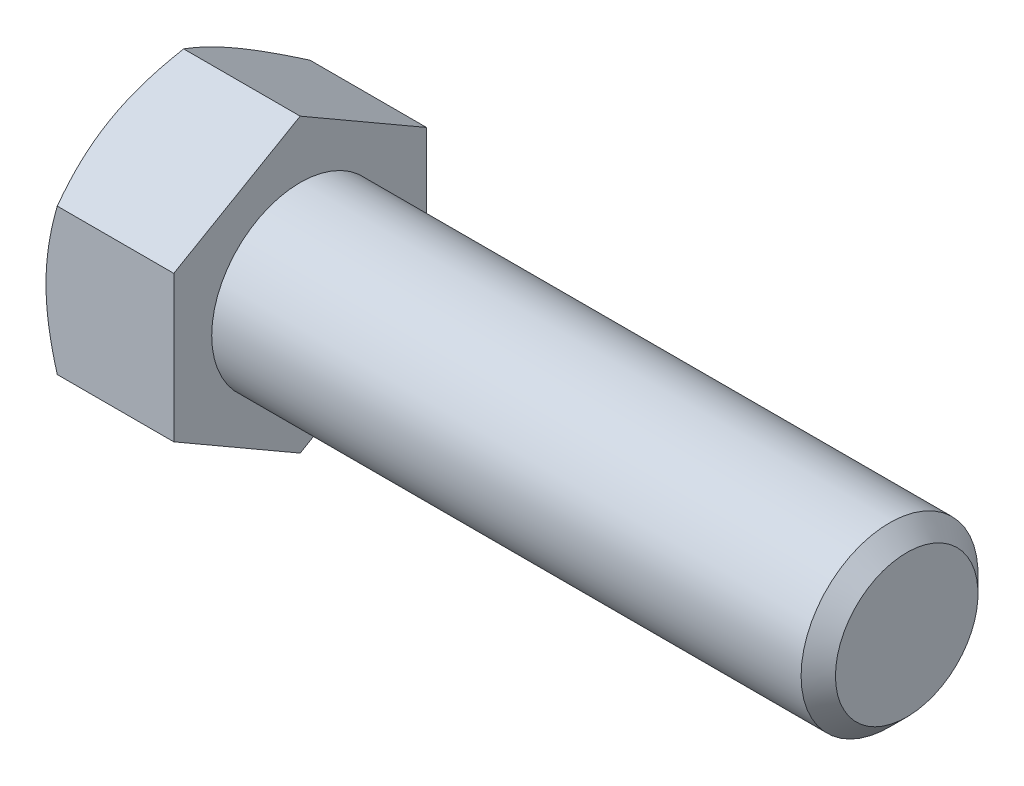
ISO-10303-21;
HEADER;
FILE_DESCRIPTION(('STEP AP214'),'2;1');
FILE_NAME('part.step','',(''),(''),'','','');
FILE_SCHEMA(('AUTOMOTIVE_DESIGN { 1 0 10303 214 1 1 1 1 }'));
ENDSEC;
DATA;
#1=APPLICATION_CONTEXT('core data for automotive mechanical design processes');
#2=APPLICATION_PROTOCOL_DEFINITION('international standard','automotive_design',2000,#1);
#3=PRODUCT_CONTEXT('',#1,'mechanical');
#4=PRODUCT('Part','Part','',(#3));
#5=PRODUCT_RELATED_PRODUCT_CATEGORY('part','',(#4));
#6=PRODUCT_DEFINITION_FORMATION('','',#4);
#7=PRODUCT_DEFINITION_CONTEXT('part definition',#1,'design');
#8=PRODUCT_DEFINITION('design','',#6,#7);
#9=PRODUCT_DEFINITION_SHAPE('','',#8);
#10=(LENGTH_UNIT() NAMED_UNIT(*) SI_UNIT(.MILLI.,.METRE.));
#11=(NAMED_UNIT(*) PLANE_ANGLE_UNIT() SI_UNIT($,.RADIAN.));
#12=(NAMED_UNIT(*) SI_UNIT($,.STERADIAN.) SOLID_ANGLE_UNIT());
#13=UNCERTAINTY_MEASURE_WITH_UNIT(LENGTH_MEASURE(1.E-05),#10,'distance_accuracy_value','');
#14=(GEOMETRIC_REPRESENTATION_CONTEXT(3) GLOBAL_UNCERTAINTY_ASSIGNED_CONTEXT((#13)) GLOBAL_UNIT_ASSIGNED_CONTEXT((#10,
#11,#12)) REPRESENTATION_CONTEXT('',''));
#15=CARTESIAN_POINT('',(0.,0.,0.));
#16=DIRECTION('',(0.,0.,1.));
#17=DIRECTION('',(1.,0.,0.));
#18=AXIS2_PLACEMENT_3D('',#15,#16,#17);
#19=CARTESIAN_POINT('',(8.0264,4.58271776169265,-7.9375));
#20=DIRECTION('',(0.,-0.866025403784438,0.500000000000001));
#21=DIRECTION('',(0.,-0.500000000000001,-0.866025403784438));
#22=AXIS2_PLACEMENT_3D('',#19,#20,#21);
#23=PLANE('',#22);
#24=CARTESIAN_POINT('',(0.709015572900506,9.16555099343915,0.0002));
#25=CARTESIAN_POINT('',(0.650866285897757,9.06481781768609,-0.174274978412064));
#26=CARTESIAN_POINT('',(0.595356039210451,8.96370907296841,-0.349400461352612));
#27=CARTESIAN_POINT('',(0.490340491808393,8.76067044758428,-0.701073676416866));
#28=CARTESIAN_POINT('',(0.440837783112744,8.65874023256945,-0.877621987648966));
#29=CARTESIAN_POINT('',(0.302312723142106,8.35131756198171,-1.41009367250543));
#30=CARTESIAN_POINT('',(0.223521451359134,8.14461157174231,-1.76811894982892));
#31=CARTESIAN_POINT('',(0.131129350120146,7.83528005201998,-2.30389685837049));
#32=CARTESIAN_POINT('',(0.10480950372743,7.7335786419499,-2.48004886781326));
#33=CARTESIAN_POINT('',(0.0606755611211444,7.529715897244,-2.83314949941432));
#34=CARTESIAN_POINT('',(0.0428607133854623,7.42755460405011,-3.01009804979308));
#35=CARTESIAN_POINT('',(0.0161882579707897,7.22305611120213,-3.36429982947704));
#36=CARTESIAN_POINT('',(0.00732048505625425,7.12071924380247,-3.54155248330069));
#37=CARTESIAN_POINT('',(-0.00126770549347207,6.91595097051382,-3.89622153641478));
#38=CARTESIAN_POINT('',(-0.000988405729574594,6.81351956764329,-4.07363793047708));
#39=CARTESIAN_POINT('',(0.00808134398118646,6.62202014420249,-4.4053246614967));
#40=CARTESIAN_POINT('',(0.0157654088390005,6.5329386103014,-4.55961840422956));
#41=CARTESIAN_POINT('',(0.0379026215782355,6.35498418068026,-4.86784451776532));
#42=CARTESIAN_POINT('',(0.0523562257657427,6.26611129943051,-5.02177686350492));
#43=CARTESIAN_POINT('',(0.105529699236182,5.99983671771855,-5.48297796779418));
#44=CARTESIAN_POINT('',(0.154055589218093,5.82290634641812,-5.78943036028855));
#45=CARTESIAN_POINT('',(0.275371211073294,5.46716874857669,-6.4055859539124));
#46=CARTESIAN_POINT('',(0.348675201689143,5.2884069236772,-6.71521051709206));
#47=CARTESIAN_POINT('',(0.515044991415641,4.93354909534665,-7.32984230522412));
#48=CARTESIAN_POINT('',(0.60807171394553,4.75744854757844,-7.63485740119938));
#49=CARTESIAN_POINT('',(0.709015572900499,4.58260229163881,-7.9377));
#50=B_SPLINE_CURVE_WITH_KNOTS('',3,(#24,#25,#26,#27,#28,#29,#30,#31,#32,#33,#34,#35,#36,#37,#38,
#39,#40,#41,#42,#43,#44,#45,#46,#47,#48,#49),.UNSPECIFIED.,.F.,.F.,(4,2,2,2,2,2,2,2,2,2,2,2,4),
(0.,0.629020687135154,1.25831181455685,2.51950872534226,3.1346613754238,3.74975965907412,
4.36415830804191,4.97853797504021,5.51339074736726,6.04827957705289,7.11881916910899,
8.21310135188791,9.30523536686631),.UNSPECIFIED.);
#51=CARTESIAN_POINT('',(0.708948904974013,9.16543552338532,0.));
#52=VERTEX_POINT('',#51);
#53=CARTESIAN_POINT('',(0.,6.87407664253898,-3.96875000000001));
#54=VERTEX_POINT('',#53);
#55=EDGE_CURVE('E53',#52,#54,#50,.T.);
#56=ORIENTED_EDGE('',*,*,#55,.F.);
#57=DIRECTION('',(-1.,0.,0.));
#58=VECTOR('',#57,1.);
#59=CARTESIAN_POINT('',(8.0264,9.16543552338532,0.));
#60=LINE('',#59,#58);
#61=CARTESIAN_POINT('',(8.0264,9.16543552338532,0.));
#62=VERTEX_POINT('',#61);
#63=EDGE_CURVE('E149',#62,#52,#60,.T.);
#64=ORIENTED_EDGE('',*,*,#63,.F.);
#65=DIRECTION('',(0.,0.500000000000001,0.866025403784438));
#66=VECTOR('',#65,1.);
#67=CARTESIAN_POINT('',(8.0264,4.58271776169265,-7.9375));
#68=LINE('',#67,#66);
#69=CARTESIAN_POINT('',(8.0264,4.58271776169265,-7.9375));
#70=VERTEX_POINT('',#69);
#71=EDGE_CURVE('E240',#70,#62,#68,.T.);
#72=ORIENTED_EDGE('',*,*,#71,.F.);
#73=DIRECTION('',(-1.,0.,0.));
#74=VECTOR('',#73,1.);
#75=CARTESIAN_POINT('',(8.0264,4.58271776169265,-7.9375));
#76=LINE('',#75,#74);
#77=CARTESIAN_POINT('',(0.708948904974006,4.58271776169265,-7.9375));
#78=VERTEX_POINT('',#77);
#79=EDGE_CURVE('E137',#70,#78,#76,.T.);
#80=ORIENTED_EDGE('',*,*,#79,.T.);
#81=EDGE_CURVE('E131',#54,#78,#50,.T.);
#82=ORIENTED_EDGE('',*,*,#81,.F.);
#83=EDGE_LOOP('',(#56,#64,#72,#80,#82));
#84=FACE_BOUND('',#83,.T.);
#85=ADVANCED_FACE('F37',(#84),#23,.F.);
#86=CARTESIAN_POINT('',(8.0264,9.16543552338532,0.));
#87=DIRECTION('',(0.,-0.866025403784438,-0.500000000000001));
#88=DIRECTION('',(0.,0.500000000000001,-0.866025403784438));
#89=AXIS2_PLACEMENT_3D('',#86,#87,#88);
#90=PLANE('',#89);
#91=CARTESIAN_POINT('',(0.709015572900498,4.58260229163881,7.9377));
#92=CARTESIAN_POINT('',(0.650866285897749,4.68333546739187,7.76322502158793));
#93=CARTESIAN_POINT('',(0.595356039210444,4.78444421210956,7.58809953864739));
#94=CARTESIAN_POINT('',(0.490340491808387,4.98748283749369,7.23642632358313));
#95=CARTESIAN_POINT('',(0.440837783112737,5.08941305250851,7.05987801235103));
#96=CARTESIAN_POINT('',(0.302312723142101,5.39683572309625,6.52740632749457));
#97=CARTESIAN_POINT('',(0.223521451359131,5.60354171333565,6.16938105017108));
#98=CARTESIAN_POINT('',(0.131129350120143,5.91287323305798,5.63360314162951));
#99=CARTESIAN_POINT('',(0.104809503727426,6.01457464312806,5.45745113218674));
#100=CARTESIAN_POINT('',(0.0606755611211416,6.21843738783396,5.10435050058568));
#101=CARTESIAN_POINT('',(0.0428607133854604,6.32059868102785,4.92740195020693));
#102=CARTESIAN_POINT('',(0.016188257970789,6.52509717387583,4.57320017052296));
#103=CARTESIAN_POINT('',(0.00732048505625397,6.62743404127549,4.39594751669932));
#104=CARTESIAN_POINT('',(-0.0012677054934723,6.83220231456414,4.04127846358523));
#105=CARTESIAN_POINT('',(-0.000988405729575111,6.93463371743467,3.86386206952292));
#106=CARTESIAN_POINT('',(0.00808134398118644,7.12613314087547,3.5321753385033));
#107=CARTESIAN_POINT('',(0.0157654088390012,7.21521467477656,3.37788159577044));
#108=CARTESIAN_POINT('',(0.0379026215782371,7.39316910439771,3.06965548223468));
#109=CARTESIAN_POINT('',(0.0523562257657446,7.48204198564745,2.91572313649509));
#110=CARTESIAN_POINT('',(0.105529699236184,7.74831656735941,2.45452203220582));
#111=CARTESIAN_POINT('',(0.154055589218096,7.92524693865984,2.14806963971145));
#112=CARTESIAN_POINT('',(0.275371211073298,8.28098453650127,1.5319140460876));
#113=CARTESIAN_POINT('',(0.348675201689148,8.45974636140077,1.22228948290794));
#114=CARTESIAN_POINT('',(0.515044991415647,8.81460418973132,0.607657694775878));
#115=CARTESIAN_POINT('',(0.608071713945535,8.99070473749953,0.302642598800622));
#116=CARTESIAN_POINT('',(0.709015572900505,9.16555099343915,-0.000200000000000082));
#117=B_SPLINE_CURVE_WITH_KNOTS('',3,(#91,#92,#93,#94,#95,#96,#97,#98,#99,#100,#101,#102,#103,
#104,#105,#106,#107,#108,#109,#110,#111,#112,#113,#114,#115,#116),.UNSPECIFIED.,.F.,.F.,(4,2,2,
2,2,2,2,2,2,2,2,2,4),(0.,0.629020687135153,1.25831181455685,2.51950872534225,3.13466137542379,
3.74975965907411,4.3641583080419,4.9785379750402,5.51339074736725,6.04827957705288,
7.11881916910898,8.21310135188791,9.30523536686631),.UNSPECIFIED.);
#118=CARTESIAN_POINT('',(0.708948904974006,4.58271776169265,7.9375));
#119=VERTEX_POINT('',#118);
#120=CARTESIAN_POINT('',(0.,6.87407664253897,3.96875000000001));
#121=VERTEX_POINT('',#120);
#122=EDGE_CURVE('E60',#119,#121,#117,.T.);
#123=ORIENTED_EDGE('',*,*,#122,.F.);
#124=DIRECTION('',(-1.,0.,0.));
#125=VECTOR('',#124,1.);
#126=CARTESIAN_POINT('',(8.0264,4.58271776169265,7.9375));
#127=LINE('',#126,#125);
#128=CARTESIAN_POINT('',(8.0264,4.58271776169265,7.9375));
#129=VERTEX_POINT('',#128);
#130=EDGE_CURVE('E147',#129,#119,#127,.T.);
#131=ORIENTED_EDGE('',*,*,#130,.F.);
#132=DIRECTION('',(0.,-0.500000000000001,0.866025403784438));
#133=VECTOR('',#132,1.);
#134=CARTESIAN_POINT('',(8.0264,9.16543552338532,0.));
#135=LINE('',#134,#133);
#136=EDGE_CURVE('E238',#62,#129,#135,.T.);
#137=ORIENTED_EDGE('',*,*,#136,.F.);
#138=ORIENTED_EDGE('',*,*,#63,.T.);
#139=EDGE_CURVE('E164',#121,#52,#117,.T.);
#140=ORIENTED_EDGE('',*,*,#139,.F.);
#141=EDGE_LOOP('',(#123,#131,#137,#138,#140));
#142=FACE_BOUND('',#141,.T.);
#143=ADVANCED_FACE('F170',(#142),#90,.F.);
#144=CARTESIAN_POINT('',(8.0264,4.58271776169265,7.9375));
#145=DIRECTION('',(0.,0.,-1.));
#146=DIRECTION('',(0.,1.,0.));
#147=AXIS2_PLACEMENT_3D('',#144,#145,#146);
#148=PLANE('',#147);
#149=CARTESIAN_POINT('',(3.89827410343074,-12.3603302058994,7.9375));
#150=CARTESIAN_POINT('',(3.72966809731243,-12.0131712508482,7.9375));
#151=CARTESIAN_POINT('',(3.56266437019351,-11.6652206880665,7.9375));
#152=CARTESIAN_POINT('',(3.23276178942121,-10.9673154538398,7.9375));
#153=CARTESIAN_POINT('',(3.06986357328631,-10.6173604813718,7.9375));
#154=CARTESIAN_POINT('',(2.74826386878714,-9.91324721678493,7.9375));
#155=CARTESIAN_POINT('',(2.58958961041773,-9.55907644474896,7.9375));
#156=CARTESIAN_POINT('',(2.27866883012241,-8.84793509488507,7.9375));
#157=CARTESIAN_POINT('',(2.12642200761481,-8.49096464891289,7.9375));
#158=CARTESIAN_POINT('',(1.82525290041148,-7.76204127426533,7.9375));
#159=CARTESIAN_POINT('',(1.67659771901794,-7.38997737838012,7.9375));
#160=CARTESIAN_POINT('',(1.39041608194967,-6.64151664147267,7.9375));
#161=CARTESIAN_POINT('',(1.2528908676531,-6.26511932245634,7.9375));
#162=CARTESIAN_POINT('',(0.992542047956164,-5.5080761242155,7.9375));
#163=CARTESIAN_POINT('',(0.869689141008563,-5.12744043047144,7.9375));
#164=CARTESIAN_POINT('',(0.642591624291928,-4.36072327201502,7.9375));
#165=CARTESIAN_POINT('',(0.538341209262477,-3.97464354694152,7.9375));
#166=CARTESIAN_POINT('',(0.353968292110576,-3.19885539800765,7.9375));
#167=CARTESIAN_POINT('',(0.273716222562405,-2.8091786168928,7.9375));
#168=CARTESIAN_POINT('',(0.174797242470086,-2.22107531367328,7.9375));
#169=CARTESIAN_POINT('',(0.145399476510061,-2.02442910751754,7.9375));
#170=CARTESIAN_POINT('',(0.0943323032601892,-1.6301421405114,7.9375));
#171=CARTESIAN_POINT('',(0.0726621481256024,-1.43250147777854,7.9375));
#172=CARTESIAN_POINT('',(0.037756525653586,-1.03909616248685,7.9375));
#173=CARTESIAN_POINT('',(0.0244137690242422,-0.843341067817106,7.9375));
#174=CARTESIAN_POINT('',(0.00602093955779107,-0.451441913889511,7.9375));
#175=CARTESIAN_POINT('',(0.000970727535240744,-0.255297861215417,7.9375));
#176=CARTESIAN_POINT('',(-0.000716381025255272,0.137029635434988,7.9375));
#177=CARTESIAN_POINT('',(0.00264680023054325,0.33321307975876,7.9375));
#178=CARTESIAN_POINT('',(0.0177037148470284,0.72526244448299,7.9375));
#179=CARTESIAN_POINT('',(0.0293978552220386,0.921128348901221,7.9375));
#180=CARTESIAN_POINT('',(0.0671339452939685,1.39023807822167,7.9375));
#181=CARTESIAN_POINT('',(0.097038683972936,1.66317786284558,7.9375));
#182=CARTESIAN_POINT('',(0.171406398869412,2.20705273784329,7.9375));
#183=CARTESIAN_POINT('',(0.215871305752492,2.47798755748581,7.9375));
#184=CARTESIAN_POINT('',(0.368750137666364,3.28745549169359,7.9375));
#185=CARTESIAN_POINT('',(0.496621869628949,3.82236351868957,7.9375));
#186=CARTESIAN_POINT('',(0.718678582615351,4.62243878679726,7.9375));
#187=CARTESIAN_POINT('',(0.798811226348153,4.89174473385347,7.9375));
#188=CARTESIAN_POINT('',(0.967471692290083,5.42774068392815,7.9375));
#189=CARTESIAN_POINT('',(1.05599957527645,5.69443066799296,7.9375));
#190=CARTESIAN_POINT('',(1.24002379081392,6.22527967321843,7.9375));
#191=CARTESIAN_POINT('',(1.33551793605537,6.48943945960569,7.9375));
#192=CARTESIAN_POINT('',(1.53234359621735,7.01556291339882,7.9375));
#193=CARTESIAN_POINT('',(1.63367500334852,7.27752662125465,7.9375));
#194=CARTESIAN_POINT('',(1.90183630049273,7.95201406215523,7.9375));
#195=CARTESIAN_POINT('',(2.07234198788932,8.36307459546483,7.9375));
#196=CARTESIAN_POINT('',(2.42261267155386,9.18124513554828,7.9375));
#197=CARTESIAN_POINT('',(2.60237849871638,9.58835478390834,7.9375));
#198=CARTESIAN_POINT('',(2.96908876108876,10.3994736602296,7.9375));
#199=CARTESIAN_POINT('',(3.15603545685473,10.8034818630204,7.9375));
#200=CARTESIAN_POINT('',(3.53547970994634,11.6088591699083,7.9375));
#201=CARTESIAN_POINT('',(3.72797708739113,12.0102283590113,7.9375));
#202=CARTESIAN_POINT('',(4.11764261293467,12.8113826782909,7.9375));
#203=CARTESIAN_POINT('',(4.31481691384112,13.2111648099818,7.9375));
#204=CARTESIAN_POINT('',(4.71270465566127,14.0089644760958,7.9375));
#205=CARTESIAN_POINT('',(4.91341811985538,14.4069819988899,7.9375));
#206=CARTESIAN_POINT('',(5.31768120592716,15.2014807688991,7.9375));
#207=CARTESIAN_POINT('',(5.52123030221656,15.5979622838517,7.9375));
#208=CARTESIAN_POINT('',(5.93069242654614,16.3897034467365,7.9375));
#209=CARTESIAN_POINT('',(6.13660546383032,16.784963089883,7.9375));
#210=CARTESIAN_POINT('',(6.71676469088136,17.8919143681109,7.9375));
#211=CARTESIAN_POINT('',(7.09321289792542,18.6024517297868,7.93749999999999));
#212=CARTESIAN_POINT('',(7.85077279697734,20.0210767135859,7.93749999999999));
#213=CARTESIAN_POINT('',(8.23188472455041,20.7291642096296,7.93749999999999));
#214=CARTESIAN_POINT('',(8.99645805033184,22.1413264870466,7.93749999999999));
#215=CARTESIAN_POINT('',(9.37990899303716,22.8454069349252,7.93749999999999));
#216=CARTESIAN_POINT('',(10.1495103573597,24.2520289175981,7.93749999999999));
#217=CARTESIAN_POINT('',(10.5356605923346,24.9545705544668,7.93749999999999));
#218=CARTESIAN_POINT('',(10.9227989231213,25.6565632293013,7.93749999999999));
#219=B_SPLINE_CURVE_WITH_KNOTS('',3,(#149,#150,#151,#152,#153,#154,#155,#156,#157,#158,#159,
#160,#161,#162,#163,#164,#165,#166,#167,#168,#169,#170,#171,#172,#173,#174,#175,#176,#177,#178,
#179,#180,#181,#182,#183,#184,#185,#186,#187,#188,#189,#190,#191,#192,#193,#194,#195,#196,#197,
#198,#199,#200,#201,#202,#203,#204,#205,#206,#207,#208,#209,#210,#211,#212,#213,#214,#215,#216,
#217,#218),.UNSPECIFIED.,.F.,.F.,(4,2,2,2,2,2,2,2,2,2,2,2,2,2,2,2,2,2,2,2,2,2,2,2,2,2,2,2,2,2,2,
2,2,2,4),(0.,1.15782473321625,2.31582816347141,3.48004931012759,4.64421595105489,
5.84606324088888,7.04804439425502,8.24758348542721,9.44674758049998,10.6393153609459,
11.2356819005535,11.8319907107153,12.4204489305093,13.0088972732802,13.5973510571101,
14.1858335921968,15.0090892087229,15.8324540324583,17.4800490495155,18.3229023249178,
19.1657617026123,20.0083575638859,20.8509378709868,22.1858341276698,23.5208503713803,
24.8562903825098,26.1916871645888,27.5289506012845,28.8662228377093,30.2032504223911,
31.5402832372043,33.9525561354447,36.364951385037,38.7701213780805,41.1751266792637),.UNSPECIFIED.);
#220=CARTESIAN_POINT('',(0.70894890497401,-4.58271776169266,7.9375));
#221=VERTEX_POINT('',#220);
#222=CARTESIAN_POINT('',(0.,0.,7.9375));
#223=VERTEX_POINT('',#222);
#224=EDGE_CURVE('E250',#221,#223,#219,.T.);
#225=ORIENTED_EDGE('',*,*,#224,.F.);
#226=DIRECTION('',(-1.,0.,0.));
#227=VECTOR('',#226,1.);
#228=CARTESIAN_POINT('',(8.0264,-4.58271776169266,7.9375));
#229=LINE('',#228,#227);
#230=CARTESIAN_POINT('',(8.0264,-4.58271776169266,7.9375));
#231=VERTEX_POINT('',#230);
#232=EDGE_CURVE('E139',#231,#221,#229,.T.);
#233=ORIENTED_EDGE('',*,*,#232,.F.);
#234=DIRECTION('',(0.,-1.,0.));
#235=VECTOR('',#234,1.);
#236=CARTESIAN_POINT('',(8.0264,4.58271776169265,7.9375));
#237=LINE('',#236,#235);
#238=EDGE_CURVE('E234',#129,#231,#237,.T.);
#239=ORIENTED_EDGE('',*,*,#238,.F.);
#240=ORIENTED_EDGE('',*,*,#130,.T.);
#241=EDGE_CURVE('E188',#223,#119,#219,.T.);
#242=ORIENTED_EDGE('',*,*,#241,.F.);
#243=EDGE_LOOP('',(#225,#233,#239,#240,#242));
#244=FACE_BOUND('',#243,.T.);
#245=ADVANCED_FACE('F256',(#244),#148,.F.);
#246=CARTESIAN_POINT('',(8.0264,-9.16543552338533,0.));
#247=DIRECTION('',(0.,0.866025403784438,-0.500000000000001));
#248=DIRECTION('',(0.,0.500000000000001,0.866025403784438));
#249=AXIS2_PLACEMENT_3D('',#246,#247,#248);
#250=PLANE('',#249);
#251=CARTESIAN_POINT('',(0.709015572900512,-9.16555099343917,-0.000200000000000159));
#252=CARTESIAN_POINT('',(0.650866285897763,-9.06481781768611,0.174274978412065));
#253=CARTESIAN_POINT('',(0.595356039210457,-8.96370907296842,0.349400461352613));
#254=CARTESIAN_POINT('',(0.490340491808399,-8.76067044758429,0.701073676416867));
#255=CARTESIAN_POINT('',(0.44083778311275,-8.65874023256946,0.877621987648966));
#256=CARTESIAN_POINT('',(0.302312723142112,-8.35131756198173,1.41009367250543));
#257=CARTESIAN_POINT('',(0.223521451359139,-8.14461157174232,1.76811894982892));
#258=CARTESIAN_POINT('',(0.131129350120151,-7.83528005201999,2.30389685837049));
#259=CARTESIAN_POINT('',(0.104809503727435,-7.73357864194991,2.48004886781326));
#260=CARTESIAN_POINT('',(0.0606755611211505,-7.52971589724401,2.83314949941433));
#261=CARTESIAN_POINT('',(0.0428607133854684,-7.42755460405012,3.01009804979308));
#262=CARTESIAN_POINT('',(0.0161882579707959,-7.22305611120214,3.36429982947704));
#263=CARTESIAN_POINT('',(0.00732048505626062,-7.12071924380248,3.54155248330069));
#264=CARTESIAN_POINT('',(-0.00126770549346593,-6.91595097051383,3.89622153641478));
#265=CARTESIAN_POINT('',(-0.000988405729568816,-6.8135195676433,4.07363793047709));
#266=CARTESIAN_POINT('',(0.00808134398119196,-6.6220201442025,4.40532466149671));
#267=CARTESIAN_POINT('',(0.0157654088390061,-6.53293861030141,4.55961840422957));
#268=CARTESIAN_POINT('',(0.0379026215782409,-6.35498418068027,4.86784451776533));
#269=CARTESIAN_POINT('',(0.0523562257657479,-6.26611129943052,5.02177686350492));
#270=CARTESIAN_POINT('',(0.105529699236187,-5.99983671771856,5.48297796779418));
#271=CARTESIAN_POINT('',(0.154055589218099,-5.82290634641813,5.78943036028855));
#272=CARTESIAN_POINT('',(0.275371211073301,-5.4671687485767,6.40558595391241));
#273=CARTESIAN_POINT('',(0.348675201689149,-5.28840692367721,6.71521051709207));
#274=CARTESIAN_POINT('',(0.515044991415645,-4.93354909534666,7.32984230522412));
#275=CARTESIAN_POINT('',(0.608071713945533,-4.75744854757845,7.63485740119938));
#276=CARTESIAN_POINT('',(0.709015572900503,-4.58260229163882,7.9377));
#277=B_SPLINE_CURVE_WITH_KNOTS('',3,(#251,#252,#253,#254,#255,#256,#257,#258,#259,#260,#261,
#262,#263,#264,#265,#266,#267,#268,#269,#270,#271,#272,#273,#274,#275,#276),.UNSPECIFIED.,.F.,
.F.,(4,2,2,2,2,2,2,2,2,2,2,2,4),(0.,0.629020687135155,1.25831181455685,2.51950872534226,
3.1346613754238,3.74975965907412,4.36415830804191,4.97853797504021,5.51339074736726,
6.04827957705289,7.11881916910899,8.21310135188791,9.30523536686631),.UNSPECIFIED.);
#278=CARTESIAN_POINT('',(0.708948904974018,-9.16543552338533,0.));
#279=VERTEX_POINT('',#278);
#280=CARTESIAN_POINT('',(0.,-6.87407664253898,3.96875000000001));
#281=VERTEX_POINT('',#280);
#282=EDGE_CURVE('E172',#279,#281,#277,.T.);
#283=ORIENTED_EDGE('',*,*,#282,.F.);
#284=DIRECTION('',(-1.,0.,0.));
#285=VECTOR('',#284,1.);
#286=CARTESIAN_POINT('',(8.0264,-9.16543552338533,0.));
#287=LINE('',#286,#285);
#288=CARTESIAN_POINT('',(8.0264,-9.16543552338533,0.));
#289=VERTEX_POINT('',#288);
#290=EDGE_CURVE('E136',#289,#279,#287,.T.);
#291=ORIENTED_EDGE('',*,*,#290,.F.);
#292=DIRECTION('',(0.,-0.500000000000001,-0.866025403784438));
#293=VECTOR('',#292,1.);
#294=CARTESIAN_POINT('',(8.0264,-9.16543552338533,0.));
#295=LINE('',#294,#293);
#296=EDGE_CURVE('E232',#231,#289,#295,.T.);
#297=ORIENTED_EDGE('',*,*,#296,.F.);
#298=ORIENTED_EDGE('',*,*,#232,.T.);
#299=EDGE_CURVE('E174',#281,#221,#277,.T.);
#300=ORIENTED_EDGE('',*,*,#299,.F.);
#301=EDGE_LOOP('',(#283,#291,#297,#298,#300));
#302=FACE_BOUND('',#301,.T.);
#303=ADVANCED_FACE('F228',(#302),#250,.F.);
#304=CARTESIAN_POINT('',(8.0264,-4.58271776169267,-7.9375));
#305=DIRECTION('',(0.,0.866025403784438,0.5));
#306=DIRECTION('',(0.,-0.5,0.866025403784439));
#307=AXIS2_PLACEMENT_3D('',#304,#305,#306);
#308=PLANE('',#307);
#309=CARTESIAN_POINT('',(0.709015572900507,-4.58260229163883,-7.9377));
#310=CARTESIAN_POINT('',(0.650866285897757,-4.68333546739189,-7.76322502158794));
#311=CARTESIAN_POINT('',(0.595356039210452,-4.78444421210958,-7.58809953864739));
#312=CARTESIAN_POINT('',(0.490340491808395,-4.98748283749371,-7.23642632358314));
#313=CARTESIAN_POINT('',(0.440837783112746,-5.08941305250853,-7.05987801235104));
#314=CARTESIAN_POINT('',(0.30231272314211,-5.39683572309627,-6.52740632749457));
#315=CARTESIAN_POINT('',(0.223521451359137,-5.60354171333567,-6.16938105017108));
#316=CARTESIAN_POINT('',(0.13112935012015,-5.912873233058,-5.63360314162951));
#317=CARTESIAN_POINT('',(0.104809503727434,-6.01457464312808,-5.45745113218674));
#318=CARTESIAN_POINT('',(0.0606755611211498,-6.21843738783398,-5.10435050058568));
#319=CARTESIAN_POINT('',(0.0428607133854681,-6.32059868102787,-4.92740195020693));
#320=CARTESIAN_POINT('',(0.0161882579707966,-6.52509717387585,-4.57320017052296));
#321=CARTESIAN_POINT('',(0.00732048505626196,-6.62743404127551,-4.39594751669931));
#322=CARTESIAN_POINT('',(-0.00126770549346325,-6.83220231456416,-4.04127846358522));
#323=CARTESIAN_POINT('',(-0.000988405729565426,-6.93463371743469,-3.86386206952292));
#324=CARTESIAN_POINT('',(0.00808134398119557,-7.12613314087549,-3.5321753385033));
#325=CARTESIAN_POINT('',(0.0157654088390093,-7.21521467477658,-3.37788159577044));
#326=CARTESIAN_POINT('',(0.0379026215782448,-7.39316910439772,-3.06965548223468));
#327=CARTESIAN_POINT('',(0.0523562257657527,-7.48204198564747,-2.91572313649508));
#328=CARTESIAN_POINT('',(0.105529699236193,-7.74831656735943,-2.45452203220582));
#329=CARTESIAN_POINT('',(0.154055589218104,-7.92524693865986,-2.14806963971145));
#330=CARTESIAN_POINT('',(0.275371211073305,-8.28098453650128,-1.5319140460876));
#331=CARTESIAN_POINT('',(0.348675201689154,-8.45974636140078,-1.22228948290794));
#332=CARTESIAN_POINT('',(0.515044991415654,-8.81460418973133,-0.607657694775878));
#333=CARTESIAN_POINT('',(0.608071713945542,-8.99070473749954,-0.302642598800624));
#334=CARTESIAN_POINT('',(0.709015572900511,-9.16555099343917,0.000199999999999153));
#335=B_SPLINE_CURVE_WITH_KNOTS('',3,(#309,#310,#311,#312,#313,#314,#315,#316,#317,#318,#319,
#320,#321,#322,#323,#324,#325,#326,#327,#328,#329,#330,#331,#332,#333,#334),.UNSPECIFIED.,.F.,
.F.,(4,2,2,2,2,2,2,2,2,2,2,2,4),(0.,0.629020687135154,1.25831181455685,2.51950872534225,
3.13466137542379,3.74975965907412,4.36415830804191,4.97853797504021,5.51339074736725,
6.04827957705289,7.11881916910899,8.21310135188791,9.30523536686631),.UNSPECIFIED.);
#336=CARTESIAN_POINT('',(0.708948904974013,-4.58271776169267,-7.9375));
#337=VERTEX_POINT('',#336);
#338=CARTESIAN_POINT('',(0.,-6.87407664253898,-3.96875));
#339=VERTEX_POINT('',#338);
#340=EDGE_CURVE('E113',#337,#339,#335,.T.);
#341=ORIENTED_EDGE('',*,*,#340,.F.);
#342=DIRECTION('',(-1.,0.,0.));
#343=VECTOR('',#342,1.);
#344=CARTESIAN_POINT('',(8.0264,-4.58271776169267,-7.9375));
#345=LINE('',#344,#343);
#346=CARTESIAN_POINT('',(8.0264,-4.58271776169267,-7.9375));
#347=VERTEX_POINT('',#346);
#348=EDGE_CURVE('E127',#347,#337,#345,.T.);
#349=ORIENTED_EDGE('',*,*,#348,.F.);
#350=DIRECTION('',(0.,0.5,-0.866025403784438));
#351=VECTOR('',#350,1.);
#352=CARTESIAN_POINT('',(8.0264,-4.58271776169267,-7.9375));
#353=LINE('',#352,#351);
#354=EDGE_CURVE('E230',#289,#347,#353,.T.);
#355=ORIENTED_EDGE('',*,*,#354,.F.);
#356=ORIENTED_EDGE('',*,*,#290,.T.);
#357=EDGE_CURVE('E130',#339,#279,#335,.T.);
#358=ORIENTED_EDGE('',*,*,#357,.F.);
#359=EDGE_LOOP('',(#341,#349,#355,#356,#358));
#360=FACE_BOUND('',#359,.T.);
#361=ADVANCED_FACE('F125',(#360),#308,.F.);
#362=CARTESIAN_POINT('',(8.0264,4.58271776169265,-7.9375));
#363=DIRECTION('',(0.,0.,1.));
#364=DIRECTION('',(0.,-1.,0.));
#365=AXIS2_PLACEMENT_3D('',#362,#363,#364);
#366=PLANE('',#365);
#367=CARTESIAN_POINT('',(3.89827410343074,-12.3603302058994,-7.93750000000001));
#368=CARTESIAN_POINT('',(3.72966809731244,-12.0131712508482,-7.93750000000001));
#369=CARTESIAN_POINT('',(3.56266437019352,-11.6652206880665,-7.93750000000001));
#370=CARTESIAN_POINT('',(3.23276178942122,-10.9673154538398,-7.93750000000001));
#371=CARTESIAN_POINT('',(3.06986357328632,-10.6173604813718,-7.93750000000001));
#372=CARTESIAN_POINT('',(2.74826386878715,-9.91324721678494,-7.93750000000001));
#373=CARTESIAN_POINT('',(2.58958961041774,-9.55907644474896,-7.93750000000001));
#374=CARTESIAN_POINT('',(2.27866883012241,-8.84793509488507,-7.93750000000001));
#375=CARTESIAN_POINT('',(2.12642200761482,-8.49096464891289,-7.93750000000001));
#376=CARTESIAN_POINT('',(1.82525290041148,-7.76204127426533,-7.93750000000001));
#377=CARTESIAN_POINT('',(1.67659771901794,-7.38997737838012,-7.93750000000001));
#378=CARTESIAN_POINT('',(1.39041608194967,-6.64151664147268,-7.93750000000001));
#379=CARTESIAN_POINT('',(1.2528908676531,-6.26511932245635,-7.9375));
#380=CARTESIAN_POINT('',(0.992542047956167,-5.50807612421551,-7.9375));
#381=CARTESIAN_POINT('',(0.869689141008566,-5.12744043047145,-7.9375));
#382=CARTESIAN_POINT('',(0.642591624291931,-4.36072327201502,-7.9375));
#383=CARTESIAN_POINT('',(0.538341209262481,-3.97464354694153,-7.9375));
#384=CARTESIAN_POINT('',(0.35396829211058,-3.19885539800766,-7.9375));
#385=CARTESIAN_POINT('',(0.273716222562408,-2.8091786168928,-7.93750000000001));
#386=CARTESIAN_POINT('',(0.174797242470089,-2.22107531367329,-7.9375));
#387=CARTESIAN_POINT('',(0.145399476510064,-2.02442910751754,-7.9375));
#388=CARTESIAN_POINT('',(0.0943323032601915,-1.63014214051141,-7.9375));
#389=CARTESIAN_POINT('',(0.0726621481256041,-1.43250147777854,-7.9375));
#390=CARTESIAN_POINT('',(0.0377565256535878,-1.03909616248686,-7.9375));
#391=CARTESIAN_POINT('',(0.0244137690242447,-0.843341067817112,-7.9375));
#392=CARTESIAN_POINT('',(0.00602093955779364,-0.451441913889517,-7.9375));
#393=CARTESIAN_POINT('',(0.000970727535242563,-0.255297861215424,-7.9375));
#394=CARTESIAN_POINT('',(-0.000716381025254076,0.137029635434982,-7.9375));
#395=CARTESIAN_POINT('',(0.00264680023054458,0.333213079758755,-7.9375));
#396=CARTESIAN_POINT('',(0.0177037148470299,0.725262444482986,-7.9375));
#397=CARTESIAN_POINT('',(0.0293978552220402,0.921128348901216,-7.9375));
#398=CARTESIAN_POINT('',(0.0671339452939697,1.39023807822167,-7.9375));
#399=CARTESIAN_POINT('',(0.0970386839729365,1.66317786284557,-7.9375));
#400=CARTESIAN_POINT('',(0.171406398869412,2.20705273784328,-7.9375));
#401=CARTESIAN_POINT('',(0.215871305752492,2.4779875574858,-7.9375));
#402=CARTESIAN_POINT('',(0.368750137666364,3.28745549169359,-7.9375));
#403=CARTESIAN_POINT('',(0.496621869628949,3.82236351868956,-7.9375));
#404=CARTESIAN_POINT('',(0.71867858261535,4.62243878679725,-7.9375));
#405=CARTESIAN_POINT('',(0.798811226348152,4.89174473385346,-7.9375));
#406=CARTESIAN_POINT('',(0.967471692290082,5.42774068392815,-7.9375));
#407=CARTESIAN_POINT('',(1.05599957527645,5.69443066799295,-7.9375));
#408=CARTESIAN_POINT('',(1.24002379081392,6.22527967321842,-7.9375));
#409=CARTESIAN_POINT('',(1.33551793605537,6.48943945960569,-7.9375));
#410=CARTESIAN_POINT('',(1.53234359621735,7.01556291339882,-7.9375));
#411=CARTESIAN_POINT('',(1.63367500334852,7.27752662125464,-7.9375));
#412=CARTESIAN_POINT('',(1.90183630049273,7.95201406215522,-7.9375));
#413=CARTESIAN_POINT('',(2.07234198788932,8.36307459546483,-7.9375));
#414=CARTESIAN_POINT('',(2.42261267155386,9.18124513554828,-7.9375));
#415=CARTESIAN_POINT('',(2.60237849871638,9.58835478390833,-7.9375));
#416=CARTESIAN_POINT('',(2.96908876108876,10.3994736602296,-7.9375));
#417=CARTESIAN_POINT('',(3.15603545685473,10.8034818630204,-7.9375));
#418=CARTESIAN_POINT('',(3.53547970994634,11.6088591699083,-7.9375));
#419=CARTESIAN_POINT('',(3.72797708739113,12.0102283590113,-7.9375));
#420=CARTESIAN_POINT('',(4.11764261293467,12.8113826782909,-7.9375));
#421=CARTESIAN_POINT('',(4.31481691384112,13.2111648099818,-7.9375));
#422=CARTESIAN_POINT('',(4.71270465566127,14.0089644760958,-7.9375));
#423=CARTESIAN_POINT('',(4.91341811985538,14.4069819988899,-7.9375));
#424=CARTESIAN_POINT('',(5.31768120592716,15.2014807688991,-7.9375));
#425=CARTESIAN_POINT('',(5.52123030221657,15.5979622838517,-7.9375));
#426=CARTESIAN_POINT('',(5.93069242654614,16.3897034467365,-7.9375));
#427=CARTESIAN_POINT('',(6.13660546383032,16.7849630898831,-7.93749999999999));
#428=CARTESIAN_POINT('',(6.71676469088136,17.8919143681109,-7.93749999999999));
#429=CARTESIAN_POINT('',(7.09321289792542,18.6024517297868,-7.93749999999999));
#430=CARTESIAN_POINT('',(7.85077279697734,20.0210767135859,-7.93749999999999));
#431=CARTESIAN_POINT('',(8.23188472455041,20.7291642096296,-7.93749999999999));
#432=CARTESIAN_POINT('',(8.99645805033184,22.1413264870466,-7.93749999999999));
#433=CARTESIAN_POINT('',(9.37990899303716,22.8454069349252,-7.93749999999999));
#434=CARTESIAN_POINT('',(10.1495103573597,24.2520289175981,-7.93749999999999));
#435=CARTESIAN_POINT('',(10.5356605923346,24.9545705544668,-7.93749999999999));
#436=CARTESIAN_POINT('',(10.9227989231213,25.6565632293013,-7.93749999999999));
#437=B_SPLINE_CURVE_WITH_KNOTS('',3,(#367,#368,#369,#370,#371,#372,#373,#374,#375,#376,#377,
#378,#379,#380,#381,#382,#383,#384,#385,#386,#387,#388,#389,#390,#391,#392,#393,#394,#395,#396,
#397,#398,#399,#400,#401,#402,#403,#404,#405,#406,#407,#408,#409,#410,#411,#412,#413,#414,#415,
#416,#417,#418,#419,#420,#421,#422,#423,#424,#425,#426,#427,#428,#429,#430,#431,#432,#433,#434,
#435,#436),.UNSPECIFIED.,.F.,.F.,(4,2,2,2,2,2,2,2,2,2,2,2,2,2,2,2,2,2,2,2,2,2,2,2,2,2,2,2,2,2,2,
2,2,2,4),(0.,1.15782473321625,2.31582816347142,3.4800493101276,4.6442159510549,5.84606324088888,
7.04804439425502,8.24758348542722,9.44674758049998,10.6393153609459,11.2356819005535,
11.8319907107153,12.4204489305093,13.0088972732802,13.5973510571101,14.1858335921968,
15.0090892087229,15.8324540324583,17.4800490495155,18.3229023249178,19.1657617026123,
20.0083575638859,20.8509378709868,22.1858341276698,23.5208503713803,24.8562903825098,
26.1916871645888,27.5289506012845,28.8662228377093,30.2032504223911,31.5402832372043,
33.9525561354447,36.3649513850371,38.7701213780805,41.1751266792637),.UNSPECIFIED.);
#438=CARTESIAN_POINT('',(0.,0.,-7.9375));
#439=VERTEX_POINT('',#438);
#440=EDGE_CURVE('E119',#78,#439,#437,.F.);
#441=ORIENTED_EDGE('',*,*,#440,.F.);
#442=ORIENTED_EDGE('',*,*,#79,.F.);
#443=DIRECTION('',(0.,1.,0.));
#444=VECTOR('',#443,1.);
#445=CARTESIAN_POINT('',(8.0264,4.58271776169265,-7.9375));
#446=LINE('',#445,#444);
#447=EDGE_CURVE('E135',#347,#70,#446,.T.);
#448=ORIENTED_EDGE('',*,*,#447,.F.);
#449=ORIENTED_EDGE('',*,*,#348,.T.);
#450=EDGE_CURVE('E110',#439,#337,#437,.F.);
#451=ORIENTED_EDGE('',*,*,#450,.F.);
#452=EDGE_LOOP('',(#441,#442,#448,#449,#451));
#453=FACE_BOUND('',#452,.T.);
#454=ADVANCED_FACE('F133',(#453),#366,.F.);
#455=CARTESIAN_POINT('',(8.0264,9.16543552338532,0.));
#456=DIRECTION('',(1.,0.,0.));
#457=DIRECTION('',(0.,0.,-1.));
#458=AXIS2_PLACEMENT_3D('',#455,#456,#457);
#459=PLANE('',#458);
#460=CARTESIAN_POINT('',(8.0264,0.,0.));
#461=DIRECTION('',(1.,0.,0.));
#462=DIRECTION('',(0.,0.,-1.));
#463=AXIS2_PLACEMENT_3D('',#460,#461,#462);
#464=CIRCLE('',#463,5.55625);
#465=CARTESIAN_POINT('',(8.0264,0.,-5.55625));
#466=VERTEX_POINT('',#465);
#467=EDGE_CURVE('E243',#466,#466,#464,.F.);
#468=ORIENTED_EDGE('',*,*,#467,.T.);
#469=EDGE_LOOP('',(#468));
#470=FACE_BOUND('',#469,.T.);
#471=ORIENTED_EDGE('',*,*,#71,.T.);
#472=ORIENTED_EDGE('',*,*,#136,.T.);
#473=ORIENTED_EDGE('',*,*,#238,.T.);
#474=ORIENTED_EDGE('',*,*,#296,.T.);
#475=ORIENTED_EDGE('',*,*,#354,.T.);
#476=ORIENTED_EDGE('',*,*,#447,.T.);
#477=EDGE_LOOP('',(#471,#472,#473,#474,#475,#476));
#478=FACE_BOUND('',#477,.T.);
#479=ADVANCED_FACE('F258',(#470,#478),#459,.T.);
#480=CARTESIAN_POINT('',(0.,0.,0.));
#481=DIRECTION('',(-1.,0.,0.));
#482=DIRECTION('',(0.,0.,1.));
#483=AXIS2_PLACEMENT_3D('',#480,#481,#482);
#484=CYLINDRICAL_SURFACE('',#483,5.55625);
#485=ORIENTED_EDGE('',*,*,#467,.F.);
#486=EDGE_LOOP('',(#485));
#487=FACE_BOUND('',#486,.T.);
#488=CARTESIAN_POINT('',(45.0469,0.,0.));
#489=DIRECTION('',(-1.,0.,0.));
#490=DIRECTION('',(0.,0.,1.));
#491=AXIS2_PLACEMENT_3D('',#488,#489,#490);
#492=CIRCLE('',#491,5.55625);
#493=CARTESIAN_POINT('',(45.0469,0.,5.55625));
#494=VERTEX_POINT('',#493);
#495=EDGE_CURVE('E246',#494,#494,#492,.T.);
#496=ORIENTED_EDGE('',*,*,#495,.T.);
#497=EDGE_LOOP('',(#496));
#498=FACE_BOUND('',#497,.T.);
#499=ADVANCED_FACE('F289',(#487,#498),#484,.T.);
#500=CARTESIAN_POINT('',(46.1264,0.,0.));
#501=DIRECTION('',(-1.,0.,0.));
#502=DIRECTION('',(0.,0.,1.));
#503=AXIS2_PLACEMENT_3D('',#500,#501,#502);
#504=CONICAL_SURFACE('',#503,4.47675,0.78539816339744);
#505=ORIENTED_EDGE('',*,*,#495,.F.);
#506=EDGE_LOOP('',(#505));
#507=FACE_BOUND('',#506,.T.);
#508=CARTESIAN_POINT('',(46.1264,0.,0.));
#509=DIRECTION('',(-1.,0.,0.));
#510=DIRECTION('',(0.,0.,1.));
#511=AXIS2_PLACEMENT_3D('',#508,#509,#510);
#512=CIRCLE('',#511,4.47675);
#513=CARTESIAN_POINT('',(46.1264,0.,4.47675));
#514=VERTEX_POINT('',#513);
#515=EDGE_CURVE('E248',#514,#514,#512,.T.);
#516=ORIENTED_EDGE('',*,*,#515,.T.);
#517=EDGE_LOOP('',(#516));
#518=FACE_BOUND('',#517,.T.);
#519=ADVANCED_FACE('F292',(#507,#518),#504,.T.);
#520=CARTESIAN_POINT('',(46.1264,0.,0.));
#521=DIRECTION('',(-1.,0.,0.));
#522=DIRECTION('',(0.,0.,1.));
#523=AXIS2_PLACEMENT_3D('',#520,#521,#522);
#524=PLANE('',#523);
#525=ORIENTED_EDGE('',*,*,#515,.F.);
#526=EDGE_LOOP('',(#525));
#527=FACE_BOUND('',#526,.T.);
#528=ADVANCED_FACE('F202',(#527),#524,.F.);
#529=CARTESIAN_POINT('',(0.,0.,0.));
#530=DIRECTION('',(1.,0.,0.));
#531=DIRECTION('',(0.,0.,-1.));
#532=AXIS2_PLACEMENT_3D('',#529,#530,#531);
#533=CONICAL_SURFACE('',#532,7.9375,1.0471975511966);
#534=ORIENTED_EDGE('',*,*,#340,.T.);
#535=CARTESIAN_POINT('',(0.,0.,0.));
#536=DIRECTION('',(1.,0.,0.));
#537=DIRECTION('',(0.,0.,-1.));
#538=AXIS2_PLACEMENT_3D('',#535,#536,#537);
#539=CIRCLE('',#538,7.9375);
#540=EDGE_CURVE('E41',#339,#439,#539,.T.);
#541=ORIENTED_EDGE('',*,*,#540,.T.);
#542=ORIENTED_EDGE('',*,*,#450,.T.);
#543=EDGE_LOOP('',(#534,#541,#542));
#544=FACE_BOUND('',#543,.T.);
#545=ADVANCED_FACE('F112',(#544),#533,.T.);
#546=ORIENTED_EDGE('',*,*,#282,.T.);
#547=EDGE_CURVE('E154',#281,#339,#539,.T.);
#548=ORIENTED_EDGE('',*,*,#547,.T.);
#549=ORIENTED_EDGE('',*,*,#357,.T.);
#550=EDGE_LOOP('',(#546,#548,#549));
#551=FACE_BOUND('',#550,.T.);
#552=ADVANCED_FACE('F201',(#551),#533,.T.);
#553=ORIENTED_EDGE('',*,*,#224,.T.);
#554=EDGE_CURVE('E155',#223,#281,#539,.T.);
#555=ORIENTED_EDGE('',*,*,#554,.T.);
#556=ORIENTED_EDGE('',*,*,#299,.T.);
#557=EDGE_LOOP('',(#553,#555,#556));
#558=FACE_BOUND('',#557,.T.);
#559=ADVANCED_FACE('F196',(#558),#533,.T.);
#560=ORIENTED_EDGE('',*,*,#241,.T.);
#561=ORIENTED_EDGE('',*,*,#122,.T.);
#562=CARTESIAN_POINT('',(0.,0.,0.));
#563=DIRECTION('',(-1.,0.,0.));
#564=DIRECTION('',(0.,0.,1.));
#565=AXIS2_PLACEMENT_3D('',#562,#563,#564);
#566=CIRCLE('',#565,7.9375);
#567=EDGE_CURVE('E120',#223,#121,#566,.T.);
#568=ORIENTED_EDGE('',*,*,#567,.F.);
#569=EDGE_LOOP('',(#560,#561,#568));
#570=FACE_BOUND('',#569,.T.);
#571=ADVANCED_FACE('F200',(#570),#533,.T.);
#572=ORIENTED_EDGE('',*,*,#139,.T.);
#573=ORIENTED_EDGE('',*,*,#55,.T.);
#574=EDGE_CURVE('E46',#54,#121,#539,.T.);
#575=ORIENTED_EDGE('',*,*,#574,.T.);
#576=EDGE_LOOP('',(#572,#573,#575));
#577=FACE_BOUND('',#576,.T.);
#578=ADVANCED_FACE('F163',(#577),#533,.T.);
#579=ORIENTED_EDGE('',*,*,#81,.T.);
#580=ORIENTED_EDGE('',*,*,#440,.T.);
#581=EDGE_CURVE('E11',#439,#54,#539,.T.);
#582=ORIENTED_EDGE('',*,*,#581,.T.);
#583=EDGE_LOOP('',(#579,#580,#582));
#584=FACE_BOUND('',#583,.T.);
#585=ADVANCED_FACE('F261',(#584),#533,.T.);
#586=CARTESIAN_POINT('',(0.,9.16543552338532,0.));
#587=DIRECTION('',(1.,0.,0.));
#588=DIRECTION('',(0.,0.,-1.));
#589=AXIS2_PLACEMENT_3D('',#586,#587,#588);
#590=PLANE('',#589);
#591=ORIENTED_EDGE('',*,*,#581,.F.);
#592=ORIENTED_EDGE('',*,*,#540,.F.);
#593=ORIENTED_EDGE('',*,*,#547,.F.);
#594=ORIENTED_EDGE('',*,*,#554,.F.);
#595=ORIENTED_EDGE('',*,*,#567,.T.);
#596=ORIENTED_EDGE('',*,*,#574,.F.);
#597=EDGE_LOOP('',(#591,#592,#593,#594,#595,#596));
#598=FACE_BOUND('',#597,.T.);
#599=ADVANCED_FACE('F167',(#598),#590,.F.);
#600=CLOSED_SHELL('',(#85,#143,#245,#303,#361,#454,#479,#499,#519,#528,#545,#552,#559,#571,#578,
#585,#599));
#601=MANIFOLD_SOLID_BREP('B2',#600);
#602=ADVANCED_BREP_SHAPE_REPRESENTATION('',(#18,#601),#14);
#603=SHAPE_DEFINITION_REPRESENTATION(#9,#602);
ENDSEC;
END-ISO-10303-21;
